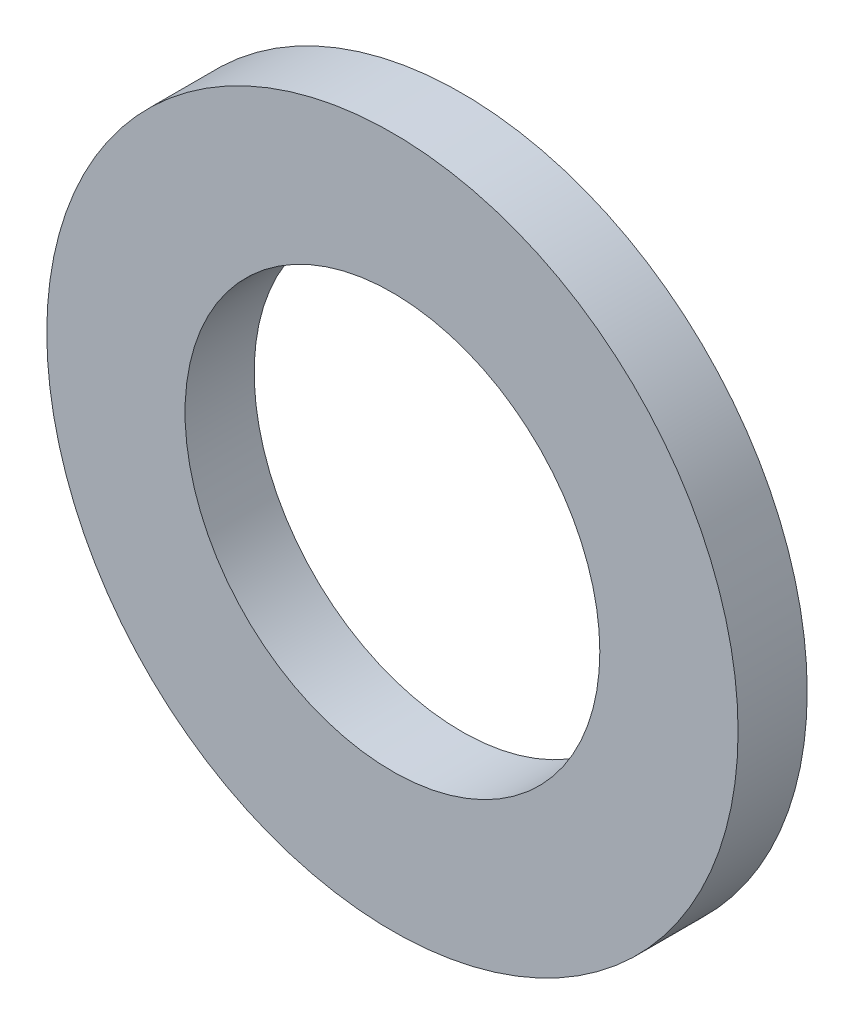
ISO-10303-21;
HEADER;
FILE_DESCRIPTION(('STEP AP214'),'2;1');
FILE_NAME('part.step','',(''),(''),'','','');
FILE_SCHEMA(('AUTOMOTIVE_DESIGN { 1 0 10303 214 1 1 1 1 }'));
ENDSEC;
DATA;
#1=APPLICATION_CONTEXT('core data for automotive mechanical design processes');
#2=APPLICATION_PROTOCOL_DEFINITION('international standard','automotive_design',2000,#1);
#3=PRODUCT_CONTEXT('',#1,'mechanical');
#4=PRODUCT('Part','Part','',(#3));
#5=PRODUCT_RELATED_PRODUCT_CATEGORY('part','',(#4));
#6=PRODUCT_DEFINITION_FORMATION('','',#4);
#7=PRODUCT_DEFINITION_CONTEXT('part definition',#1,'design');
#8=PRODUCT_DEFINITION('design','',#6,#7);
#9=PRODUCT_DEFINITION_SHAPE('','',#8);
#10=(LENGTH_UNIT() NAMED_UNIT(*) SI_UNIT(.MILLI.,.METRE.));
#11=(NAMED_UNIT(*) PLANE_ANGLE_UNIT() SI_UNIT($,.RADIAN.));
#12=(NAMED_UNIT(*) SI_UNIT($,.STERADIAN.) SOLID_ANGLE_UNIT());
#13=UNCERTAINTY_MEASURE_WITH_UNIT(LENGTH_MEASURE(1.E-05),#10,'distance_accuracy_value','');
#14=(GEOMETRIC_REPRESENTATION_CONTEXT(3) GLOBAL_UNCERTAINTY_ASSIGNED_CONTEXT((#13)) GLOBAL_UNIT_ASSIGNED_CONTEXT((#10,
#11,#12)) REPRESENTATION_CONTEXT('',''));
#15=CARTESIAN_POINT('',(0.,0.,0.));
#16=DIRECTION('',(0.,0.,1.));
#17=DIRECTION('',(1.,0.,0.));
#18=AXIS2_PLACEMENT_3D('',#15,#16,#17);
#19=CARTESIAN_POINT('',(0.,0.,1.));
#20=DIRECTION('',(0.,0.,1.));
#21=DIRECTION('',(1.,0.,0.));
#22=AXIS2_PLACEMENT_3D('',#19,#20,#21);
#23=PLANE('',#22);
#24=CARTESIAN_POINT('',(0.,0.,1.));
#25=DIRECTION('',(0.,0.,1.));
#26=DIRECTION('',(1.,0.,0.));
#27=AXIS2_PLACEMENT_3D('',#24,#25,#26);
#28=CIRCLE('',#27,10.);
#29=CARTESIAN_POINT('',(10.,0.,1.));
#30=VERTEX_POINT('',#29);
#31=EDGE_CURVE('E10',#30,#30,#28,.T.);
#32=ORIENTED_EDGE('',*,*,#31,.T.);
#33=EDGE_LOOP('',(#32));
#34=FACE_BOUND('',#33,.T.);
#35=CARTESIAN_POINT('',(0.,0.,1.));
#36=DIRECTION('',(0.,0.,1.));
#37=DIRECTION('',(1.,0.,0.));
#38=AXIS2_PLACEMENT_3D('',#35,#36,#37);
#39=CIRCLE('',#38,6.);
#40=CARTESIAN_POINT('',(6.,0.,1.));
#41=VERTEX_POINT('',#40);
#42=EDGE_CURVE('E55',#41,#41,#39,.T.);
#43=ORIENTED_EDGE('',*,*,#42,.F.);
#44=EDGE_LOOP('',(#43));
#45=FACE_BOUND('',#44,.T.);
#46=ADVANCED_FACE('F41',(#34,#45),#23,.T.);
#47=CARTESIAN_POINT('',(0.,0.,-1.));
#48=DIRECTION('',(0.,0.,1.));
#49=DIRECTION('',(1.,0.,0.));
#50=AXIS2_PLACEMENT_3D('',#47,#48,#49);
#51=PLANE('',#50);
#52=CARTESIAN_POINT('',(0.,0.,-1.));
#53=DIRECTION('',(0.,0.,1.));
#54=DIRECTION('',(1.,0.,0.));
#55=AXIS2_PLACEMENT_3D('',#52,#53,#54);
#56=CIRCLE('',#55,10.);
#57=CARTESIAN_POINT('',(10.,0.,-1.));
#58=VERTEX_POINT('',#57);
#59=EDGE_CURVE('E45',#58,#58,#56,.T.);
#60=ORIENTED_EDGE('',*,*,#59,.F.);
#61=EDGE_LOOP('',(#60));
#62=FACE_BOUND('',#61,.T.);
#63=CARTESIAN_POINT('',(0.,0.,-1.));
#64=DIRECTION('',(0.,0.,1.));
#65=DIRECTION('',(1.,0.,0.));
#66=AXIS2_PLACEMENT_3D('',#63,#64,#65);
#67=CIRCLE('',#66,6.);
#68=CARTESIAN_POINT('',(6.,0.,-1.));
#69=VERTEX_POINT('',#68);
#70=EDGE_CURVE('E57',#69,#69,#67,.T.);
#71=ORIENTED_EDGE('',*,*,#70,.T.);
#72=EDGE_LOOP('',(#71));
#73=FACE_BOUND('',#72,.T.);
#74=ADVANCED_FACE('F70',(#62,#73),#51,.F.);
#75=CARTESIAN_POINT('',(0.,0.,1.));
#76=DIRECTION('',(0.,0.,-1.));
#77=DIRECTION('',(-1.,0.,0.));
#78=AXIS2_PLACEMENT_3D('',#75,#76,#77);
#79=CYLINDRICAL_SURFACE('',#78,10.);
#80=ORIENTED_EDGE('',*,*,#31,.F.);
#81=EDGE_LOOP('',(#80));
#82=FACE_BOUND('',#81,.T.);
#83=ORIENTED_EDGE('',*,*,#59,.T.);
#84=EDGE_LOOP('',(#83));
#85=FACE_BOUND('',#84,.T.);
#86=ADVANCED_FACE('F43',(#82,#85),#79,.T.);
#87=CARTESIAN_POINT('',(0.,0.,1.));
#88=DIRECTION('',(0.,0.,-1.));
#89=DIRECTION('',(-1.,0.,0.));
#90=AXIS2_PLACEMENT_3D('',#87,#88,#89);
#91=CYLINDRICAL_SURFACE('',#90,6.);
#92=ORIENTED_EDGE('',*,*,#42,.T.);
#93=EDGE_LOOP('',(#92));
#94=FACE_BOUND('',#93,.T.);
#95=ORIENTED_EDGE('',*,*,#70,.F.);
#96=EDGE_LOOP('',(#95));
#97=FACE_BOUND('',#96,.T.);
#98=ADVANCED_FACE('F66',(#94,#97),#91,.F.);
#99=CLOSED_SHELL('',(#46,#74,#86,#98));
#100=MANIFOLD_SOLID_BREP('B2',#99);
#101=ADVANCED_BREP_SHAPE_REPRESENTATION('',(#18,#100),#14);
#102=SHAPE_DEFINITION_REPRESENTATION(#9,#101);
ENDSEC;
END-ISO-10303-21;
